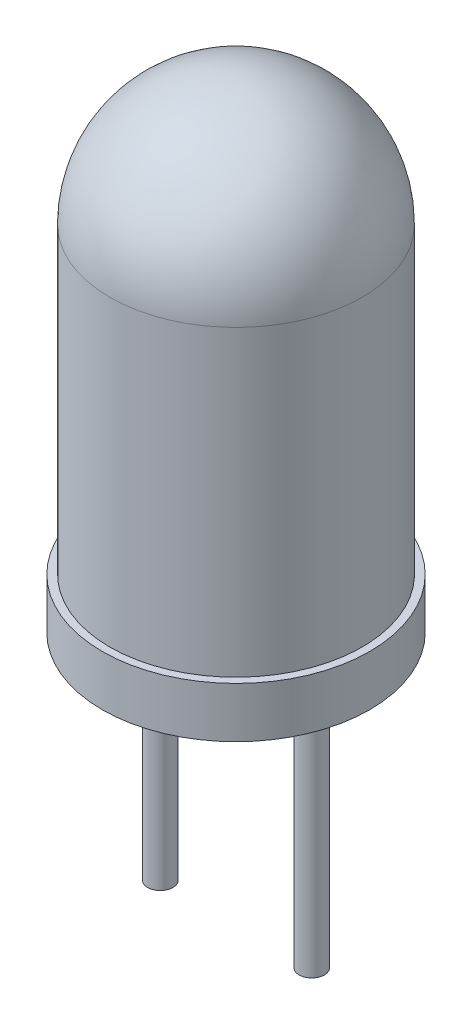
ISO-10303-21;
HEADER;
FILE_DESCRIPTION(('STEP AP214'),'2;1');
FILE_NAME('part.step','',(''),(''),'','','');
FILE_SCHEMA(('AUTOMOTIVE_DESIGN { 1 0 10303 214 1 1 1 1 }'));
ENDSEC;
DATA;
#1=APPLICATION_CONTEXT('core data for automotive mechanical design processes');
#2=APPLICATION_PROTOCOL_DEFINITION('international standard','automotive_design',2000,#1);
#3=PRODUCT_CONTEXT('',#1,'mechanical');
#4=PRODUCT('Part','Part','',(#3));
#5=PRODUCT_RELATED_PRODUCT_CATEGORY('part','',(#4));
#6=PRODUCT_DEFINITION_FORMATION('','',#4);
#7=PRODUCT_DEFINITION_CONTEXT('part definition',#1,'design');
#8=PRODUCT_DEFINITION('design','',#6,#7);
#9=PRODUCT_DEFINITION_SHAPE('','',#8);
#10=(LENGTH_UNIT() NAMED_UNIT(*) SI_UNIT(.MILLI.,.METRE.));
#11=(NAMED_UNIT(*) PLANE_ANGLE_UNIT() SI_UNIT($,.RADIAN.));
#12=(NAMED_UNIT(*) SI_UNIT($,.STERADIAN.) SOLID_ANGLE_UNIT());
#13=UNCERTAINTY_MEASURE_WITH_UNIT(LENGTH_MEASURE(1.E-05),#10,'distance_accuracy_value','');
#14=(GEOMETRIC_REPRESENTATION_CONTEXT(3) GLOBAL_UNCERTAINTY_ASSIGNED_CONTEXT((#13)) GLOBAL_UNIT_ASSIGNED_CONTEXT((#10,
#11,#12)) REPRESENTATION_CONTEXT('',''));
#15=CARTESIAN_POINT('',(0.,0.,0.));
#16=DIRECTION('',(0.,0.,1.));
#17=DIRECTION('',(1.,0.,0.));
#18=AXIS2_PLACEMENT_3D('',#15,#16,#17);
#19=CARTESIAN_POINT('',(0.,-0.431829006767632,2.5));
#20=DIRECTION('',(0.,1.,0.));
#21=DIRECTION('',(0.,0.,1.));
#22=AXIS2_PLACEMENT_3D('',#19,#20,#21);
#23=PLANE('',#22);
#24=CARTESIAN_POINT('',(0.,-0.431829006767631,0.));
#25=DIRECTION('',(0.,1.,0.));
#26=DIRECTION('',(0.,0.,1.));
#27=AXIS2_PLACEMENT_3D('',#24,#25,#26);
#28=CIRCLE('',#27,2.65);
#29=CARTESIAN_POINT('',(0.,-0.431829006767632,2.65));
#30=VERTEX_POINT('',#29);
#31=EDGE_CURVE('E56',#30,#30,#28,.T.);
#32=ORIENTED_EDGE('',*,*,#31,.T.);
#33=EDGE_LOOP('',(#32));
#34=FACE_BOUND('',#33,.T.);
#35=CARTESIAN_POINT('',(0.,-0.431829006767631,0.));
#36=DIRECTION('',(0.,1.,0.));
#37=DIRECTION('',(0.,0.,1.));
#38=AXIS2_PLACEMENT_3D('',#35,#36,#37);
#39=CIRCLE('',#38,2.5);
#40=CARTESIAN_POINT('',(0.,-0.431829006767632,2.5));
#41=VERTEX_POINT('',#40);
#42=EDGE_CURVE('E10',#41,#41,#39,.T.);
#43=ORIENTED_EDGE('',*,*,#42,.F.);
#44=EDGE_LOOP('',(#43));
#45=FACE_BOUND('',#44,.T.);
#46=ADVANCED_FACE('F39',(#34,#45),#23,.T.);
#47=CARTESIAN_POINT('',(0.,8.06817099323237,0.));
#48=DIRECTION('',(0.,1.,0.));
#49=DIRECTION('',(0.,0.,1.));
#50=AXIS2_PLACEMENT_3D('',#47,#48,#49);
#51=CYLINDRICAL_SURFACE('',#50,2.5);
#52=ORIENTED_EDGE('',*,*,#42,.T.);
#53=EDGE_LOOP('',(#52));
#54=FACE_BOUND('',#53,.T.);
#55=CARTESIAN_POINT('',(0.,5.56817099323237,0.));
#56=DIRECTION('',(0.,1.,0.));
#57=DIRECTION('',(0.,0.,1.));
#58=AXIS2_PLACEMENT_3D('',#55,#56,#57);
#59=CIRCLE('',#58,2.5);
#60=CARTESIAN_POINT('',(0.,5.56817099323237,2.5));
#61=VERTEX_POINT('',#60);
#62=EDGE_CURVE('E46',#61,#61,#59,.T.);
#63=ORIENTED_EDGE('',*,*,#62,.F.);
#64=EDGE_LOOP('',(#63));
#65=FACE_BOUND('',#64,.T.);
#66=ADVANCED_FACE('F106',(#54,#65),#51,.T.);
#67=CARTESIAN_POINT('',(0.,5.56817099323237,0.));
#68=DIRECTION('',(0.,1.,0.));
#69=DIRECTION('',(0.,0.,1.));
#70=AXIS2_PLACEMENT_3D('',#67,#68,#69);
#71=SPHERICAL_SURFACE('',#70,2.5);
#72=ORIENTED_EDGE('',*,*,#62,.T.);
#73=EDGE_LOOP('',(#72));
#74=FACE_BOUND('',#73,.T.);
#75=ADVANCED_FACE('F92',(#74),#71,.T.);
#76=CARTESIAN_POINT('',(0.,-1.43182900676763,2.65));
#77=DIRECTION('',(0.,-1.,0.));
#78=DIRECTION('',(0.,0.,-1.));
#79=AXIS2_PLACEMENT_3D('',#76,#77,#78);
#80=PLANE('',#79);
#81=CARTESIAN_POINT('',(1.5,-1.43182900676763,0.));
#82=DIRECTION('',(0.,-1.,0.));
#83=DIRECTION('',(0.,0.,1.));
#84=AXIS2_PLACEMENT_3D('',#81,#82,#83);
#85=CIRCLE('',#84,0.25);
#86=CARTESIAN_POINT('',(1.5,-1.43182900676763,0.25));
#87=VERTEX_POINT('',#86);
#88=EDGE_CURVE('E71',#87,#87,#85,.T.);
#89=ORIENTED_EDGE('',*,*,#88,.F.);
#90=EDGE_LOOP('',(#89));
#91=FACE_BOUND('',#90,.T.);
#92=CARTESIAN_POINT('',(-1.5,-1.43182900676763,0.));
#93=DIRECTION('',(0.,-1.,0.));
#94=DIRECTION('',(0.,0.,-1.));
#95=AXIS2_PLACEMENT_3D('',#92,#93,#94);
#96=CIRCLE('',#95,0.25);
#97=CARTESIAN_POINT('',(-1.5,-1.43182900676763,-0.25));
#98=VERTEX_POINT('',#97);
#99=EDGE_CURVE('E63',#98,#98,#96,.T.);
#100=ORIENTED_EDGE('',*,*,#99,.F.);
#101=EDGE_LOOP('',(#100));
#102=FACE_BOUND('',#101,.T.);
#103=CARTESIAN_POINT('',(0.,-1.43182900676763,0.));
#104=DIRECTION('',(0.,1.,0.));
#105=DIRECTION('',(0.,0.,1.));
#106=AXIS2_PLACEMENT_3D('',#103,#104,#105);
#107=CIRCLE('',#106,2.65);
#108=CARTESIAN_POINT('',(0.,-1.43182900676763,2.65));
#109=VERTEX_POINT('',#108);
#110=EDGE_CURVE('E51',#109,#109,#107,.T.);
#111=ORIENTED_EDGE('',*,*,#110,.F.);
#112=EDGE_LOOP('',(#111));
#113=FACE_BOUND('',#112,.T.);
#114=ADVANCED_FACE('F88',(#91,#102,#113),#80,.T.);
#115=CARTESIAN_POINT('',(0.,8.06817099323237,0.));
#116=DIRECTION('',(0.,1.,0.));
#117=DIRECTION('',(0.,0.,1.));
#118=AXIS2_PLACEMENT_3D('',#115,#116,#117);
#119=CYLINDRICAL_SURFACE('',#118,2.65);
#120=ORIENTED_EDGE('',*,*,#110,.T.);
#121=EDGE_LOOP('',(#120));
#122=FACE_BOUND('',#121,.T.);
#123=ORIENTED_EDGE('',*,*,#31,.F.);
#124=EDGE_LOOP('',(#123));
#125=FACE_BOUND('',#124,.T.);
#126=ADVANCED_FACE('F91',(#122,#125),#119,.T.);
#127=CARTESIAN_POINT('',(-1.5,-6.43182900676763,0.));
#128=DIRECTION('',(0.,1.,0.));
#129=DIRECTION('',(0.,0.,1.));
#130=AXIS2_PLACEMENT_3D('',#127,#128,#129);
#131=CYLINDRICAL_SURFACE('',#130,0.25);
#132=CARTESIAN_POINT('',(-1.5,-6.43182900676763,0.));
#133=DIRECTION('',(0.,-1.,0.));
#134=DIRECTION('',(0.,0.,-1.));
#135=AXIS2_PLACEMENT_3D('',#132,#133,#134);
#136=CIRCLE('',#135,0.25);
#137=CARTESIAN_POINT('',(-1.5,-6.43182900676763,-0.25));
#138=VERTEX_POINT('',#137);
#139=EDGE_CURVE('E62',#138,#138,#136,.T.);
#140=ORIENTED_EDGE('',*,*,#139,.F.);
#141=EDGE_LOOP('',(#140));
#142=FACE_BOUND('',#141,.T.);
#143=ORIENTED_EDGE('',*,*,#99,.T.);
#144=EDGE_LOOP('',(#143));
#145=FACE_BOUND('',#144,.T.);
#146=ADVANCED_FACE('F100',(#142,#145),#131,.T.);
#147=CARTESIAN_POINT('',(-1.5,-6.43182900676763,0.));
#148=DIRECTION('',(0.,-1.,0.));
#149=DIRECTION('',(0.,0.,-1.));
#150=AXIS2_PLACEMENT_3D('',#147,#148,#149);
#151=PLANE('',#150);
#152=ORIENTED_EDGE('',*,*,#139,.T.);
#153=EDGE_LOOP('',(#152));
#154=FACE_BOUND('',#153,.T.);
#155=ADVANCED_FACE('F84',(#154),#151,.T.);
#156=CARTESIAN_POINT('',(1.5,-6.43182900676763,0.));
#157=DIRECTION('',(0.,1.,0.));
#158=DIRECTION('',(0.,0.,1.));
#159=AXIS2_PLACEMENT_3D('',#156,#157,#158);
#160=CYLINDRICAL_SURFACE('',#159,0.25);
#161=CARTESIAN_POINT('',(1.5,-6.43182900676763,0.));
#162=DIRECTION('',(0.,-1.,0.));
#163=DIRECTION('',(0.,0.,1.));
#164=AXIS2_PLACEMENT_3D('',#161,#162,#163);
#165=CIRCLE('',#164,0.25);
#166=CARTESIAN_POINT('',(1.5,-6.43182900676763,0.25));
#167=VERTEX_POINT('',#166);
#168=EDGE_CURVE('E67',#167,#167,#165,.T.);
#169=ORIENTED_EDGE('',*,*,#168,.F.);
#170=EDGE_LOOP('',(#169));
#171=FACE_BOUND('',#170,.T.);
#172=ORIENTED_EDGE('',*,*,#88,.T.);
#173=EDGE_LOOP('',(#172));
#174=FACE_BOUND('',#173,.T.);
#175=ADVANCED_FACE('F81',(#171,#174),#160,.T.);
#176=CARTESIAN_POINT('',(1.5,-6.43182900676763,0.));
#177=DIRECTION('',(0.,1.,0.));
#178=DIRECTION('',(0.,0.,1.));
#179=AXIS2_PLACEMENT_3D('',#176,#177,#178);
#180=PLANE('',#179);
#181=ORIENTED_EDGE('',*,*,#168,.T.);
#182=EDGE_LOOP('',(#181));
#183=FACE_BOUND('',#182,.T.);
#184=ADVANCED_FACE('F79',(#183),#180,.F.);
#185=CLOSED_SHELL('',(#46,#66,#75,#114,#126,#146,#155,#175,#184));
#186=MANIFOLD_SOLID_BREP('B2',#185);
#187=ADVANCED_BREP_SHAPE_REPRESENTATION('',(#18,#186),#14);
#188=SHAPE_DEFINITION_REPRESENTATION(#9,#187);
ENDSEC;
END-ISO-10303-21;
